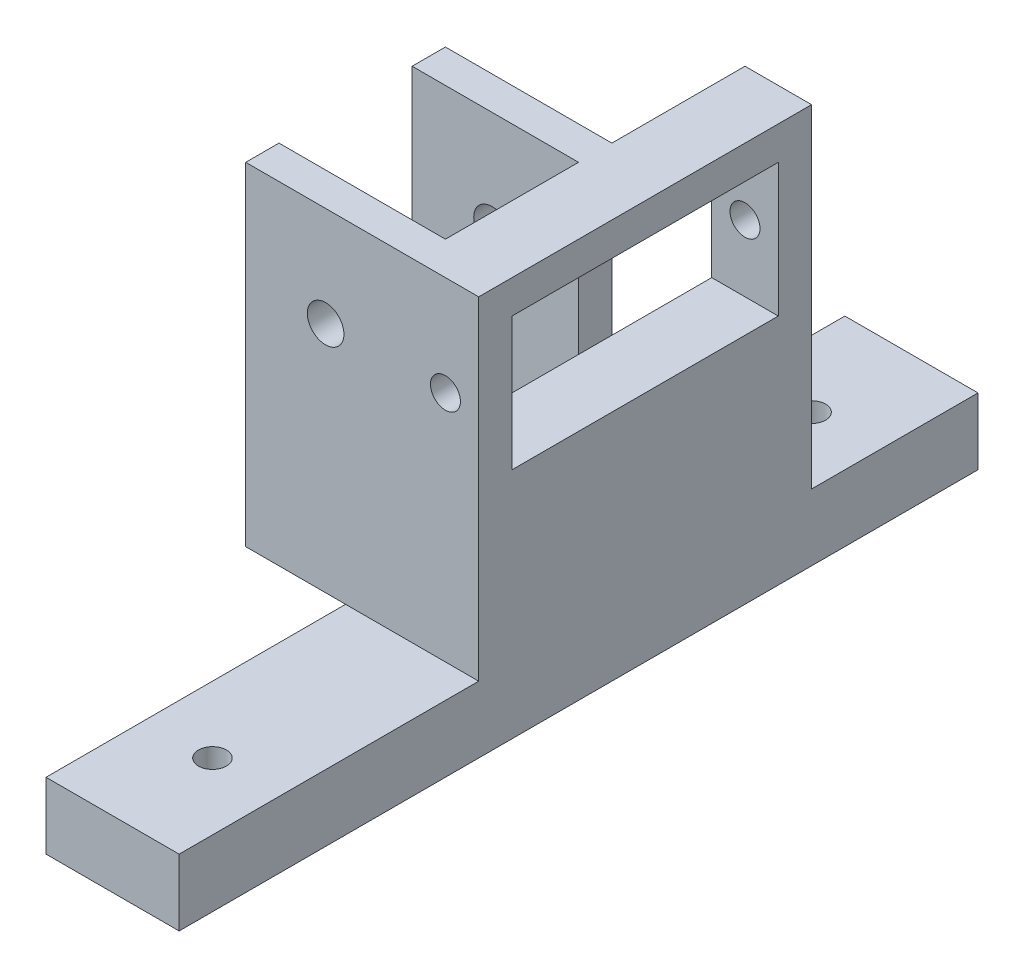
ISO-10303-21;
HEADER;
FILE_DESCRIPTION(('STEP AP214'),'2;1');
FILE_NAME('part.step','',(''),(''),'','','');
FILE_SCHEMA(('AUTOMOTIVE_DESIGN { 1 0 10303 214 1 1 1 1 }'));
ENDSEC;
DATA;
#1=APPLICATION_CONTEXT('core data for automotive mechanical design processes');
#2=APPLICATION_PROTOCOL_DEFINITION('international standard','automotive_design',2000,#1);
#3=PRODUCT_CONTEXT('',#1,'mechanical');
#4=PRODUCT('Part','Part','',(#3));
#5=PRODUCT_RELATED_PRODUCT_CATEGORY('part','',(#4));
#6=PRODUCT_DEFINITION_FORMATION('','',#4);
#7=PRODUCT_DEFINITION_CONTEXT('part definition',#1,'design');
#8=PRODUCT_DEFINITION('design','',#6,#7);
#9=PRODUCT_DEFINITION_SHAPE('','',#8);
#10=(LENGTH_UNIT() NAMED_UNIT(*) SI_UNIT(.MILLI.,.METRE.));
#11=(NAMED_UNIT(*) PLANE_ANGLE_UNIT() SI_UNIT($,.RADIAN.));
#12=(NAMED_UNIT(*) SI_UNIT($,.STERADIAN.) SOLID_ANGLE_UNIT());
#13=UNCERTAINTY_MEASURE_WITH_UNIT(LENGTH_MEASURE(1.E-05),#10,'distance_accuracy_value','');
#14=(GEOMETRIC_REPRESENTATION_CONTEXT(3) GLOBAL_UNCERTAINTY_ASSIGNED_CONTEXT((#13)) GLOBAL_UNIT_ASSIGNED_CONTEXT((#10,
#11,#12)) REPRESENTATION_CONTEXT('',''));
#15=CARTESIAN_POINT('',(0.,0.,0.));
#16=DIRECTION('',(0.,0.,1.));
#17=DIRECTION('',(1.,0.,0.));
#18=AXIS2_PLACEMENT_3D('',#15,#16,#17);
#19=CARTESIAN_POINT('',(0.,5.,0.));
#20=DIRECTION('',(0.,-1.,0.));
#21=DIRECTION('',(0.,0.,-1.));
#22=AXIS2_PLACEMENT_3D('',#19,#20,#21);
#23=PLANE('',#22);
#24=CARTESIAN_POINT('',(30.,5.,-85.));
#25=DIRECTION('',(0.,1.,0.));
#26=DIRECTION('',(0.,0.,1.));
#27=AXIS2_PLACEMENT_3D('',#24,#25,#26);
#28=CIRCLE('',#27,2.1);
#29=CARTESIAN_POINT('',(30.,5.,-82.9));
#30=VERTEX_POINT('',#29);
#31=EDGE_CURVE('E486',#30,#30,#28,.T.);
#32=ORIENTED_EDGE('',*,*,#31,.F.);
#33=EDGE_LOOP('',(#32));
#34=FACE_BOUND('',#33,.T.);
#35=DIRECTION('',(1.,0.,0.));
#36=VECTOR('',#35,1.);
#37=CARTESIAN_POINT('',(-10.,5.,-100.));
#38=LINE('',#37,#36);
#39=CARTESIAN_POINT('',(20.,5.,-100.));
#40=VERTEX_POINT('',#39);
#41=CARTESIAN_POINT('',(40.,5.,-100.));
#42=VERTEX_POINT('',#41);
#43=EDGE_CURVE('E297',#40,#42,#38,.T.);
#44=ORIENTED_EDGE('',*,*,#43,.F.);
#45=DIRECTION('',(0.,0.,-1.));
#46=VECTOR('',#45,1.);
#47=CARTESIAN_POINT('',(20.,5.,-100.));
#48=LINE('',#47,#46);
#49=CARTESIAN_POINT('',(20.,5.,-55.));
#50=VERTEX_POINT('',#49);
#51=EDGE_CURVE('E229',#50,#40,#48,.T.);
#52=ORIENTED_EDGE('',*,*,#51,.F.);
#53=DIRECTION('',(1.,0.,0.));
#54=VECTOR('',#53,1.);
#55=CARTESIAN_POINT('',(5.,5.,-55.));
#56=LINE('',#55,#54);
#57=CARTESIAN_POINT('',(30.,5.,-55.));
#58=VERTEX_POINT('',#57);
#59=EDGE_CURVE('E385',#50,#58,#56,.T.);
#60=ORIENTED_EDGE('',*,*,#59,.T.);
#61=DIRECTION('',(0.,0.,-1.));
#62=VECTOR('',#61,1.);
#63=CARTESIAN_POINT('',(30.,5.,0.));
#64=LINE('',#63,#62);
#65=CARTESIAN_POINT('',(30.,5.,-75.));
#66=VERTEX_POINT('',#65);
#67=EDGE_CURVE('E248',#58,#66,#64,.T.);
#68=ORIENTED_EDGE('',*,*,#67,.T.);
#69=DIRECTION('',(-1.,0.,0.));
#70=VECTOR('',#69,1.);
#71=CARTESIAN_POINT('',(40.,5.,-75.));
#72=LINE('',#71,#70);
#73=CARTESIAN_POINT('',(40.,5.,-75.));
#74=VERTEX_POINT('',#73);
#75=EDGE_CURVE('E289',#74,#66,#72,.T.);
#76=ORIENTED_EDGE('',*,*,#75,.F.);
#77=DIRECTION('',(0.,0.,-1.));
#78=VECTOR('',#77,1.);
#79=CARTESIAN_POINT('',(40.,5.,0.));
#80=LINE('',#79,#78);
#81=EDGE_CURVE('E52',#74,#42,#80,.T.);
#82=ORIENTED_EDGE('',*,*,#81,.T.);
#83=EDGE_LOOP('',(#44,#52,#60,#68,#76,#82));
#84=FACE_BOUND('',#83,.T.);
#85=ADVANCED_FACE('F43',(#34,#84),#23,.F.);
#86=DIRECTION('',(1.,0.,0.));
#87=VECTOR('',#86,1.);
#88=CARTESIAN_POINT('',(5.,5.,-50.));
#89=LINE('',#88,#87);
#90=CARTESIAN_POINT('',(20.,5.,-50.));
#91=VERTEX_POINT('',#90);
#92=CARTESIAN_POINT('',(30.,5.,-50.));
#93=VERTEX_POINT('',#92);
#94=EDGE_CURVE('E60',#91,#93,#89,.T.);
#95=ORIENTED_EDGE('',*,*,#94,.F.);
#96=DIRECTION('',(0.,0.,-1.));
#97=VECTOR('',#96,1.);
#98=CARTESIAN_POINT('',(20.,5.,-25.));
#99=LINE('',#98,#97);
#100=CARTESIAN_POINT('',(20.,5.,-30.));
#101=VERTEX_POINT('',#100);
#102=EDGE_CURVE('E207',#101,#91,#99,.T.);
#103=ORIENTED_EDGE('',*,*,#102,.F.);
#104=DIRECTION('',(1.,0.,0.));
#105=VECTOR('',#104,1.);
#106=CARTESIAN_POINT('',(10.,5.,-30.));
#107=LINE('',#106,#105);
#108=CARTESIAN_POINT('',(30.,5.,-30.));
#109=VERTEX_POINT('',#108);
#110=EDGE_CURVE('E328',#101,#109,#107,.T.);
#111=ORIENTED_EDGE('',*,*,#110,.T.);
#112=EDGE_CURVE('E255',#109,#93,#64,.T.);
#113=ORIENTED_EDGE('',*,*,#112,.T.);
#114=EDGE_LOOP('',(#95,#103,#111,#113));
#115=FACE_BOUND('',#114,.T.);
#116=ADVANCED_FACE('F462',(#115),#23,.F.);
#117=CARTESIAN_POINT('',(30.,55.,0.));
#118=DIRECTION('',(-1.,0.,0.));
#119=DIRECTION('',(0.,0.,1.));
#120=AXIS2_PLACEMENT_3D('',#117,#118,#119);
#121=PLANE('',#120);
#122=DIRECTION('',(0.,0.,-1.));
#123=VECTOR('',#122,1.);
#124=CARTESIAN_POINT('',(30.,55.,0.));
#125=LINE('',#124,#123);
#126=CARTESIAN_POINT('',(30.,55.,-30.));
#127=VERTEX_POINT('',#126);
#128=CARTESIAN_POINT('',(30.,55.,-50.));
#129=VERTEX_POINT('',#128);
#130=EDGE_CURVE('E249',#127,#129,#125,.T.);
#131=ORIENTED_EDGE('',*,*,#130,.T.);
#132=DIRECTION('',(0.,-1.,0.));
#133=VECTOR('',#132,1.);
#134=CARTESIAN_POINT('',(30.,80.4950975679639,-50.));
#135=LINE('',#134,#133);
#136=CARTESIAN_POINT('',(30.,50.,-50.));
#137=VERTEX_POINT('',#136);
#138=EDGE_CURVE('E382',#129,#137,#135,.T.);
#139=ORIENTED_EDGE('',*,*,#138,.T.);
#140=DIRECTION('',(0.,0.,-1.));
#141=VECTOR('',#140,1.);
#142=CARTESIAN_POINT('',(30.,50.,-3.07417596432748));
#143=LINE('',#142,#141);
#144=CARTESIAN_POINT('',(30.,50.,-30.));
#145=VERTEX_POINT('',#144);
#146=EDGE_CURVE('E352',#145,#137,#143,.T.);
#147=ORIENTED_EDGE('',*,*,#146,.F.);
#148=DIRECTION('',(0.,-1.,0.));
#149=VECTOR('',#148,1.);
#150=CARTESIAN_POINT('',(30.,55.,-30.));
#151=LINE('',#150,#149);
#152=EDGE_CURVE('E331',#127,#145,#151,.T.);
#153=ORIENTED_EDGE('',*,*,#152,.F.);
#154=EDGE_LOOP('',(#131,#139,#147,#153));
#155=FACE_BOUND('',#154,.T.);
#156=ADVANCED_FACE('F380',(#155),#121,.T.);
#157=DIRECTION('',(0.,0.,-1.));
#158=VECTOR('',#157,1.);
#159=CARTESIAN_POINT('',(30.,30.,-3.07417596432748));
#160=LINE('',#159,#158);
#161=CARTESIAN_POINT('',(30.,30.,-30.));
#162=VERTEX_POINT('',#161);
#163=CARTESIAN_POINT('',(30.,30.,-50.));
#164=VERTEX_POINT('',#163);
#165=EDGE_CURVE('E346',#162,#164,#160,.T.);
#166=ORIENTED_EDGE('',*,*,#165,.T.);
#167=EDGE_CURVE('E388',#164,#93,#135,.T.);
#168=ORIENTED_EDGE('',*,*,#167,.T.);
#169=ORIENTED_EDGE('',*,*,#112,.F.);
#170=EDGE_CURVE('E330',#162,#109,#151,.T.);
#171=ORIENTED_EDGE('',*,*,#170,.F.);
#172=EDGE_LOOP('',(#166,#168,#169,#171));
#173=FACE_BOUND('',#172,.T.);
#174=ADVANCED_FACE('F479',(#173),#121,.T.);
#175=CARTESIAN_POINT('',(30.,50.,-3.07417596432748));
#176=DIRECTION('',(0.,1.,0.));
#177=DIRECTION('',(0.,0.,1.));
#178=AXIS2_PLACEMENT_3D('',#175,#176,#177);
#179=PLANE('',#178);
#180=DIRECTION('',(1.,0.,0.));
#181=VECTOR('',#180,1.);
#182=CARTESIAN_POINT('',(40.,50.,-70.));
#183=LINE('',#182,#181);
#184=CARTESIAN_POINT('',(30.,50.,-70.));
#185=VERTEX_POINT('',#184);
#186=CARTESIAN_POINT('',(40.,50.,-70.));
#187=VERTEX_POINT('',#186);
#188=EDGE_CURVE('E276',#185,#187,#183,.T.);
#189=ORIENTED_EDGE('',*,*,#188,.T.);
#190=DIRECTION('',(0.,0.,-1.));
#191=VECTOR('',#190,1.);
#192=CARTESIAN_POINT('',(40.,50.,-3.07417596432748));
#193=LINE('',#192,#191);
#194=CARTESIAN_POINT('',(40.,50.,-30.));
#195=VERTEX_POINT('',#194);
#196=EDGE_CURVE('E240',#195,#187,#193,.T.);
#197=ORIENTED_EDGE('',*,*,#196,.F.);
#198=DIRECTION('',(1.,0.,0.));
#199=VECTOR('',#198,1.);
#200=CARTESIAN_POINT('',(30.,50.,-30.));
#201=LINE('',#200,#199);
#202=EDGE_CURVE('E234',#145,#195,#201,.T.);
#203=ORIENTED_EDGE('',*,*,#202,.F.);
#204=ORIENTED_EDGE('',*,*,#146,.T.);
#205=DIRECTION('',(0.,0.,1.));
#206=VECTOR('',#205,1.);
#207=CARTESIAN_POINT('',(30.,50.,-3.07417596432748));
#208=LINE('',#207,#206);
#209=CARTESIAN_POINT('',(30.,50.,-55.));
#210=VERTEX_POINT('',#209);
#211=EDGE_CURVE('E267',#210,#137,#208,.T.);
#212=ORIENTED_EDGE('',*,*,#211,.F.);
#213=EDGE_CURVE('E68',#210,#185,#143,.T.);
#214=ORIENTED_EDGE('',*,*,#213,.T.);
#215=EDGE_LOOP('',(#189,#197,#203,#204,#212,#214));
#216=FACE_BOUND('',#215,.T.);
#217=ADVANCED_FACE('F357',(#216),#179,.F.);
#218=CARTESIAN_POINT('',(30.,30.,-3.07417596432748));
#219=DIRECTION('',(0.,1.,0.));
#220=DIRECTION('',(0.,0.,1.));
#221=AXIS2_PLACEMENT_3D('',#218,#219,#220);
#222=PLANE('',#221);
#223=DIRECTION('',(0.,0.,-1.));
#224=VECTOR('',#223,1.);
#225=CARTESIAN_POINT('',(40.,30.,-3.07417596432748));
#226=LINE('',#225,#224);
#227=CARTESIAN_POINT('',(40.,30.,-30.));
#228=VERTEX_POINT('',#227);
#229=CARTESIAN_POINT('',(40.,30.,-70.));
#230=VERTEX_POINT('',#229);
#231=EDGE_CURVE('E342',#228,#230,#226,.T.);
#232=ORIENTED_EDGE('',*,*,#231,.T.);
#233=DIRECTION('',(1.,0.,0.));
#234=VECTOR('',#233,1.);
#235=CARTESIAN_POINT('',(40.,30.,-70.));
#236=LINE('',#235,#234);
#237=CARTESIAN_POINT('',(30.,30.,-70.));
#238=VERTEX_POINT('',#237);
#239=EDGE_CURVE('E264',#238,#230,#236,.T.);
#240=ORIENTED_EDGE('',*,*,#239,.F.);
#241=CARTESIAN_POINT('',(30.,30.,-55.));
#242=VERTEX_POINT('',#241);
#243=EDGE_CURVE('E341',#242,#238,#160,.T.);
#244=ORIENTED_EDGE('',*,*,#243,.F.);
#245=DIRECTION('',(0.,0.,1.));
#246=VECTOR('',#245,1.);
#247=CARTESIAN_POINT('',(30.,30.,-3.07417596432748));
#248=LINE('',#247,#246);
#249=EDGE_CURVE('E272',#242,#164,#248,.T.);
#250=ORIENTED_EDGE('',*,*,#249,.T.);
#251=ORIENTED_EDGE('',*,*,#165,.F.);
#252=DIRECTION('',(1.,0.,0.));
#253=VECTOR('',#252,1.);
#254=CARTESIAN_POINT('',(30.,30.,-30.));
#255=LINE('',#254,#253);
#256=EDGE_CURVE('E345',#162,#228,#255,.T.);
#257=ORIENTED_EDGE('',*,*,#256,.T.);
#258=EDGE_LOOP('',(#232,#240,#244,#250,#251,#257));
#259=FACE_BOUND('',#258,.T.);
#260=ADVANCED_FACE('F369',(#259),#222,.T.);
#261=CARTESIAN_POINT('',(30.,5.,5.));
#262=DIRECTION('',(0.,1.,0.));
#263=DIRECTION('',(0.,0.,1.));
#264=AXIS2_PLACEMENT_3D('',#261,#262,#263);
#265=CIRCLE('',#264,2.1);
#266=CARTESIAN_POINT('',(30.,5.,7.1));
#267=VERTEX_POINT('',#266);
#268=EDGE_CURVE('E484',#267,#267,#265,.T.);
#269=ORIENTED_EDGE('',*,*,#268,.F.);
#270=EDGE_LOOP('',(#269));
#271=FACE_BOUND('',#270,.T.);
#272=DIRECTION('',(1.,0.,0.));
#273=VECTOR('',#272,1.);
#274=CARTESIAN_POINT('',(0.,5.,-25.));
#275=LINE('',#274,#273);
#276=CARTESIAN_POINT('',(20.,5.,-25.));
#277=VERTEX_POINT('',#276);
#278=CARTESIAN_POINT('',(40.,5.,-25.));
#279=VERTEX_POINT('',#278);
#280=EDGE_CURVE('E215',#277,#279,#275,.T.);
#281=ORIENTED_EDGE('',*,*,#280,.F.);
#282=DIRECTION('',(0.,0.,-1.));
#283=VECTOR('',#282,1.);
#284=CARTESIAN_POINT('',(20.,5.,20.));
#285=LINE('',#284,#283);
#286=CARTESIAN_POINT('',(20.,5.,20.));
#287=VERTEX_POINT('',#286);
#288=EDGE_CURVE('E222',#287,#277,#285,.T.);
#289=ORIENTED_EDGE('',*,*,#288,.F.);
#290=DIRECTION('',(-1.,0.,0.));
#291=VECTOR('',#290,1.);
#292=CARTESIAN_POINT('',(40.,5.,20.));
#293=LINE('',#292,#291);
#294=CARTESIAN_POINT('',(40.,5.,20.));
#295=VERTEX_POINT('',#294);
#296=EDGE_CURVE('E339',#295,#287,#293,.T.);
#297=ORIENTED_EDGE('',*,*,#296,.F.);
#298=EDGE_CURVE('E11',#295,#279,#80,.T.);
#299=ORIENTED_EDGE('',*,*,#298,.T.);
#300=EDGE_LOOP('',(#281,#289,#297,#299));
#301=FACE_BOUND('',#300,.T.);
#302=ADVANCED_FACE('F231',(#271,#301),#23,.F.);
#303=DIRECTION('',(0.,-1.,0.));
#304=VECTOR('',#303,1.);
#305=CARTESIAN_POINT('',(30.,80.4950975679639,-55.));
#306=LINE('',#305,#304);
#307=CARTESIAN_POINT('',(30.,55.,-55.));
#308=VERTEX_POINT('',#307);
#309=EDGE_CURVE('E408',#308,#210,#306,.T.);
#310=ORIENTED_EDGE('',*,*,#309,.F.);
#311=CARTESIAN_POINT('',(30.,55.,-75.));
#312=VERTEX_POINT('',#311);
#313=EDGE_CURVE('E252',#308,#312,#125,.T.);
#314=ORIENTED_EDGE('',*,*,#313,.T.);
#315=DIRECTION('',(0.,1.,0.));
#316=VECTOR('',#315,1.);
#317=CARTESIAN_POINT('',(30.,5.,-75.));
#318=LINE('',#317,#316);
#319=EDGE_CURVE('E292',#66,#312,#318,.T.);
#320=ORIENTED_EDGE('',*,*,#319,.F.);
#321=ORIENTED_EDGE('',*,*,#67,.F.);
#322=EDGE_CURVE('E412',#242,#58,#306,.T.);
#323=ORIENTED_EDGE('',*,*,#322,.F.);
#324=ORIENTED_EDGE('',*,*,#243,.T.);
#325=DIRECTION('',(0.,-1.,0.));
#326=VECTOR('',#325,1.);
#327=CARTESIAN_POINT('',(30.,50.,-70.));
#328=LINE('',#327,#326);
#329=EDGE_CURVE('E283',#185,#238,#328,.T.);
#330=ORIENTED_EDGE('',*,*,#329,.F.);
#331=ORIENTED_EDGE('',*,*,#213,.F.);
#332=EDGE_LOOP('',(#310,#314,#320,#321,#323,#324,#330,#331));
#333=FACE_BOUND('',#332,.T.);
#334=ADVANCED_FACE('F360',(#333),#121,.T.);
#335=CARTESIAN_POINT('',(35.,40.,-75.));
#336=DIRECTION('',(0.,0.,1.));
#337=DIRECTION('',(1.,0.,0.));
#338=AXIS2_PLACEMENT_3D('',#335,#336,#337);
#339=CYLINDRICAL_SURFACE('',#338,2.25);
#340=CARTESIAN_POINT('',(35.,40.,-30.));
#341=DIRECTION('',(0.,0.,1.));
#342=DIRECTION('',(1.,0.,0.));
#343=AXIS2_PLACEMENT_3D('',#340,#341,#342);
#344=CIRCLE('',#343,2.25);
#345=CARTESIAN_POINT('',(37.25,40.,-30.));
#346=VERTEX_POINT('',#345);
#347=EDGE_CURVE('E333',#346,#346,#344,.T.);
#348=ORIENTED_EDGE('',*,*,#347,.F.);
#349=EDGE_LOOP('',(#348));
#350=FACE_BOUND('',#349,.T.);
#351=CARTESIAN_POINT('',(35.,40.,-25.));
#352=DIRECTION('',(0.,0.,-1.));
#353=DIRECTION('',(-1.,0.,0.));
#354=AXIS2_PLACEMENT_3D('',#351,#352,#353);
#355=CIRCLE('',#354,2.25);
#356=CARTESIAN_POINT('',(32.75,40.,-25.));
#357=VERTEX_POINT('',#356);
#358=EDGE_CURVE('E259',#357,#357,#355,.T.);
#359=ORIENTED_EDGE('',*,*,#358,.F.);
#360=EDGE_LOOP('',(#359));
#361=FACE_BOUND('',#360,.T.);
#362=ADVANCED_FACE('F478',(#350,#361),#339,.F.);
#363=CARTESIAN_POINT('',(0.,55.,-30.));
#364=DIRECTION('',(0.,0.,1.));
#365=DIRECTION('',(1.,0.,0.));
#366=AXIS2_PLACEMENT_3D('',#363,#364,#365);
#367=PLANE('',#366);
#368=CARTESIAN_POINT('',(17.,40.,-30.));
#369=DIRECTION('',(0.,0.,1.));
#370=DIRECTION('',(1.,0.,0.));
#371=AXIS2_PLACEMENT_3D('',#368,#369,#370);
#372=CIRCLE('',#371,2.75);
#373=CARTESIAN_POINT('',(19.75,40.,-30.));
#374=VERTEX_POINT('',#373);
#375=EDGE_CURVE('E323',#374,#374,#372,.T.);
#376=ORIENTED_EDGE('',*,*,#375,.T.);
#377=EDGE_LOOP('',(#376));
#378=FACE_BOUND('',#377,.T.);
#379=ORIENTED_EDGE('',*,*,#347,.T.);
#380=EDGE_LOOP('',(#379));
#381=FACE_BOUND('',#380,.T.);
#382=DIRECTION('',(0.,-1.,0.));
#383=VECTOR('',#382,1.);
#384=CARTESIAN_POINT('',(40.,55.,-30.));
#385=LINE('',#384,#383);
#386=EDGE_CURVE('E237',#195,#228,#385,.T.);
#387=ORIENTED_EDGE('',*,*,#386,.T.);
#388=ORIENTED_EDGE('',*,*,#256,.F.);
#389=ORIENTED_EDGE('',*,*,#170,.T.);
#390=ORIENTED_EDGE('',*,*,#110,.F.);
#391=CARTESIAN_POINT('',(5.,5.,-30.));
#392=VERTEX_POINT('',#391);
#393=EDGE_CURVE('E201',#392,#101,#107,.T.);
#394=ORIENTED_EDGE('',*,*,#393,.F.);
#395=DIRECTION('',(0.,-1.,0.));
#396=VECTOR('',#395,1.);
#397=CARTESIAN_POINT('',(5.,55.,-30.));
#398=LINE('',#397,#396);
#399=CARTESIAN_POINT('',(5.,55.,-30.));
#400=VERTEX_POINT('',#399);
#401=EDGE_CURVE('E311',#400,#392,#398,.T.);
#402=ORIENTED_EDGE('',*,*,#401,.F.);
#403=DIRECTION('',(1.,0.,0.));
#404=VECTOR('',#403,1.);
#405=CARTESIAN_POINT('',(10.,55.,-30.));
#406=LINE('',#405,#404);
#407=EDGE_CURVE('E326',#400,#127,#406,.T.);
#408=ORIENTED_EDGE('',*,*,#407,.T.);
#409=ORIENTED_EDGE('',*,*,#152,.T.);
#410=ORIENTED_EDGE('',*,*,#202,.T.);
#411=EDGE_LOOP('',(#387,#388,#389,#390,#394,#402,#408,#409,#410));
#412=FACE_BOUND('',#411,.T.);
#413=ADVANCED_FACE('F375',(#378,#381,#412),#367,.F.);
#414=CARTESIAN_POINT('',(40.,5.,0.));
#415=DIRECTION('',(-1.,0.,0.));
#416=DIRECTION('',(0.,0.,1.));
#417=AXIS2_PLACEMENT_3D('',#414,#415,#416);
#418=PLANE('',#417);
#419=DIRECTION('',(0.,-1.,0.));
#420=VECTOR('',#419,1.);
#421=CARTESIAN_POINT('',(40.,30.,-75.));
#422=LINE('',#421,#420);
#423=CARTESIAN_POINT('',(40.,55.,-75.));
#424=VERTEX_POINT('',#423);
#425=EDGE_CURVE('E295',#424,#74,#422,.T.);
#426=ORIENTED_EDGE('',*,*,#425,.F.);
#427=DIRECTION('',(0.,0.,-1.));
#428=VECTOR('',#427,1.);
#429=CARTESIAN_POINT('',(40.,55.,0.));
#430=LINE('',#429,#428);
#431=CARTESIAN_POINT('',(40.,55.,-25.));
#432=VERTEX_POINT('',#431);
#433=EDGE_CURVE('E251',#432,#424,#430,.T.);
#434=ORIENTED_EDGE('',*,*,#433,.F.);
#435=DIRECTION('',(0.,-1.,0.));
#436=VECTOR('',#435,1.);
#437=CARTESIAN_POINT('',(40.,55.,-25.));
#438=LINE('',#437,#436);
#439=EDGE_CURVE('E246',#432,#279,#438,.T.);
#440=ORIENTED_EDGE('',*,*,#439,.T.);
#441=ORIENTED_EDGE('',*,*,#298,.F.);
#442=DIRECTION('',(0.,1.,0.));
#443=VECTOR('',#442,1.);
#444=CARTESIAN_POINT('',(40.,0.,20.));
#445=LINE('',#444,#443);
#446=CARTESIAN_POINT('',(40.,-5.,20.));
#447=VERTEX_POINT('',#446);
#448=EDGE_CURVE('E336',#447,#295,#445,.T.);
#449=ORIENTED_EDGE('',*,*,#448,.F.);
#450=DIRECTION('',(0.,0.,1.));
#451=VECTOR('',#450,1.);
#452=CARTESIAN_POINT('',(40.,-5.,-80.));
#453=LINE('',#452,#451);
#454=CARTESIAN_POINT('',(40.,-5.,-100.));
#455=VERTEX_POINT('',#454);
#456=EDGE_CURVE('E305',#455,#447,#453,.T.);
#457=ORIENTED_EDGE('',*,*,#456,.F.);
#458=DIRECTION('',(0.,-1.,0.));
#459=VECTOR('',#458,1.);
#460=CARTESIAN_POINT('',(40.,5.,-100.));
#461=LINE('',#460,#459);
#462=EDGE_CURVE('E299',#42,#455,#461,.T.);
#463=ORIENTED_EDGE('',*,*,#462,.F.);
#464=ORIENTED_EDGE('',*,*,#81,.F.);
#465=EDGE_LOOP('',(#426,#434,#440,#441,#449,#457,#463,#464));
#466=FACE_BOUND('',#465,.T.);
#467=ORIENTED_EDGE('',*,*,#196,.T.);
#468=DIRECTION('',(0.,-1.,0.));
#469=VECTOR('',#468,1.);
#470=CARTESIAN_POINT('',(40.,50.,-70.));
#471=LINE('',#470,#469);
#472=EDGE_CURVE('E279',#187,#230,#471,.T.);
#473=ORIENTED_EDGE('',*,*,#472,.T.);
#474=ORIENTED_EDGE('',*,*,#231,.F.);
#475=ORIENTED_EDGE('',*,*,#386,.F.);
#476=EDGE_LOOP('',(#467,#473,#474,#475));
#477=FACE_BOUND('',#476,.T.);
#478=ADVANCED_FACE('F45',(#466,#477),#418,.F.);
#479=CARTESIAN_POINT('',(0.,55.,0.));
#480=DIRECTION('',(0.,1.,0.));
#481=DIRECTION('',(0.,0.,1.));
#482=AXIS2_PLACEMENT_3D('',#479,#480,#481);
#483=PLANE('',#482);
#484=ORIENTED_EDGE('',*,*,#433,.T.);
#485=DIRECTION('',(1.,0.,0.));
#486=VECTOR('',#485,1.);
#487=CARTESIAN_POINT('',(30.,55.,-75.));
#488=LINE('',#487,#486);
#489=EDGE_CURVE('E286',#312,#424,#488,.T.);
#490=ORIENTED_EDGE('',*,*,#489,.F.);
#491=ORIENTED_EDGE('',*,*,#313,.F.);
#492=DIRECTION('',(1.,0.,0.));
#493=VECTOR('',#492,1.);
#494=CARTESIAN_POINT('',(5.,55.,-55.));
#495=LINE('',#494,#493);
#496=CARTESIAN_POINT('',(5.,55.,-55.));
#497=VERTEX_POINT('',#496);
#498=EDGE_CURVE('E409',#497,#308,#495,.T.);
#499=ORIENTED_EDGE('',*,*,#498,.F.);
#500=DIRECTION('',(0.,0.,-1.));
#501=VECTOR('',#500,1.);
#502=CARTESIAN_POINT('',(5.,55.,-50.));
#503=LINE('',#502,#501);
#504=CARTESIAN_POINT('',(5.,55.,-50.));
#505=VERTEX_POINT('',#504);
#506=EDGE_CURVE('E405',#505,#497,#503,.T.);
#507=ORIENTED_EDGE('',*,*,#506,.F.);
#508=DIRECTION('',(1.,0.,0.));
#509=VECTOR('',#508,1.);
#510=CARTESIAN_POINT('',(5.,55.,-50.));
#511=LINE('',#510,#509);
#512=EDGE_CURVE('E403',#505,#129,#511,.T.);
#513=ORIENTED_EDGE('',*,*,#512,.T.);
#514=ORIENTED_EDGE('',*,*,#130,.F.);
#515=ORIENTED_EDGE('',*,*,#407,.F.);
#516=DIRECTION('',(0.,0.,-1.));
#517=VECTOR('',#516,1.);
#518=CARTESIAN_POINT('',(5.,55.,-25.));
#519=LINE('',#518,#517);
#520=CARTESIAN_POINT('',(5.,55.,-25.));
#521=VERTEX_POINT('',#520);
#522=EDGE_CURVE('E314',#521,#400,#519,.T.);
#523=ORIENTED_EDGE('',*,*,#522,.F.);
#524=DIRECTION('',(1.,0.,0.));
#525=VECTOR('',#524,1.);
#526=CARTESIAN_POINT('',(0.,55.,-25.));
#527=LINE('',#526,#525);
#528=EDGE_CURVE('E233',#521,#432,#527,.T.);
#529=ORIENTED_EDGE('',*,*,#528,.T.);
#530=EDGE_LOOP('',(#484,#490,#491,#499,#507,#513,#514,#515,#523,#529));
#531=FACE_BOUND('',#530,.T.);
#532=ADVANCED_FACE('F535',(#531),#483,.T.);
#533=CARTESIAN_POINT('',(0.,55.,-25.));
#534=DIRECTION('',(0.,0.,-1.));
#535=DIRECTION('',(-1.,0.,0.));
#536=AXIS2_PLACEMENT_3D('',#533,#534,#535);
#537=PLANE('',#536);
#538=CARTESIAN_POINT('',(17.,40.,-25.));
#539=DIRECTION('',(0.,0.,1.));
#540=DIRECTION('',(1.,0.,0.));
#541=AXIS2_PLACEMENT_3D('',#538,#539,#540);
#542=CIRCLE('',#541,2.75);
#543=CARTESIAN_POINT('',(19.75,40.,-25.));
#544=VERTEX_POINT('',#543);
#545=EDGE_CURVE('E320',#544,#544,#542,.T.);
#546=ORIENTED_EDGE('',*,*,#545,.F.);
#547=EDGE_LOOP('',(#546));
#548=FACE_BOUND('',#547,.T.);
#549=DIRECTION('',(0.,1.,0.));
#550=VECTOR('',#549,1.);
#551=CARTESIAN_POINT('',(5.,5.,-25.));
#552=LINE('',#551,#550);
#553=CARTESIAN_POINT('',(5.00000000000001,5.,-25.));
#554=VERTEX_POINT('',#553);
#555=EDGE_CURVE('E217',#554,#521,#552,.T.);
#556=ORIENTED_EDGE('',*,*,#555,.F.);
#557=DIRECTION('',(-1.,0.,0.));
#558=VECTOR('',#557,1.);
#559=CARTESIAN_POINT('',(51.6227766016838,5.,-25.));
#560=LINE('',#559,#558);
#561=EDGE_CURVE('E198',#277,#554,#560,.T.);
#562=ORIENTED_EDGE('',*,*,#561,.F.);
#563=ORIENTED_EDGE('',*,*,#280,.T.);
#564=ORIENTED_EDGE('',*,*,#439,.F.);
#565=ORIENTED_EDGE('',*,*,#528,.F.);
#566=EDGE_LOOP('',(#556,#562,#563,#564,#565));
#567=FACE_BOUND('',#566,.T.);
#568=ORIENTED_EDGE('',*,*,#358,.T.);
#569=EDGE_LOOP('',(#568));
#570=FACE_BOUND('',#569,.T.);
#571=ADVANCED_FACE('F211',(#548,#567,#570),#537,.F.);
#572=CARTESIAN_POINT('',(0.,0.,20.));
#573=DIRECTION('',(0.,0.,1.));
#574=DIRECTION('',(1.,0.,0.));
#575=AXIS2_PLACEMENT_3D('',#572,#573,#574);
#576=PLANE('',#575);
#577=DIRECTION('',(0.,1.,0.));
#578=VECTOR('',#577,1.);
#579=CARTESIAN_POINT('',(20.,-5.,20.));
#580=LINE('',#579,#578);
#581=CARTESIAN_POINT('',(20.,-5.,20.));
#582=VERTEX_POINT('',#581);
#583=EDGE_CURVE('E225',#582,#287,#580,.T.);
#584=ORIENTED_EDGE('',*,*,#583,.F.);
#585=DIRECTION('',(-1.,0.,0.));
#586=VECTOR('',#585,1.);
#587=CARTESIAN_POINT('',(40.,-5.,20.));
#588=LINE('',#587,#586);
#589=EDGE_CURVE('E308',#447,#582,#588,.T.);
#590=ORIENTED_EDGE('',*,*,#589,.F.);
#591=ORIENTED_EDGE('',*,*,#448,.T.);
#592=ORIENTED_EDGE('',*,*,#296,.T.);
#593=EDGE_LOOP('',(#584,#590,#591,#592));
#594=FACE_BOUND('',#593,.T.);
#595=ADVANCED_FACE('F534',(#594),#576,.T.);
#596=CARTESIAN_POINT('',(17.,40.,-62.778174593052));
#597=DIRECTION('',(0.,0.,1.));
#598=DIRECTION('',(1.,0.,0.));
#599=AXIS2_PLACEMENT_3D('',#596,#597,#598);
#600=CYLINDRICAL_SURFACE('',#599,2.75);
#601=ORIENTED_EDGE('',*,*,#545,.T.);
#602=EDGE_LOOP('',(#601));
#603=FACE_BOUND('',#602,.T.);
#604=ORIENTED_EDGE('',*,*,#375,.F.);
#605=EDGE_LOOP('',(#604));
#606=FACE_BOUND('',#605,.T.);
#607=ADVANCED_FACE('F687',(#603,#606),#600,.F.);
#608=CARTESIAN_POINT('',(5.,0.,0.));
#609=DIRECTION('',(-1.,0.,0.));
#610=DIRECTION('',(0.,0.,1.));
#611=AXIS2_PLACEMENT_3D('',#608,#609,#610);
#612=PLANE('',#611);
#613=DIRECTION('',(0.,0.,1.));
#614=VECTOR('',#613,1.);
#615=CARTESIAN_POINT('',(5.,5.,-30.));
#616=LINE('',#615,#614);
#617=EDGE_CURVE('E318',#392,#554,#616,.T.);
#618=ORIENTED_EDGE('',*,*,#617,.T.);
#619=ORIENTED_EDGE('',*,*,#555,.T.);
#620=ORIENTED_EDGE('',*,*,#522,.T.);
#621=ORIENTED_EDGE('',*,*,#401,.T.);
#622=EDGE_LOOP('',(#618,#619,#620,#621));
#623=FACE_BOUND('',#622,.T.);
#624=ADVANCED_FACE('F678',(#623),#612,.T.);
#625=CARTESIAN_POINT('',(0.,-5.,0.));
#626=DIRECTION('',(0.,-1.,0.));
#627=DIRECTION('',(0.,0.,-1.));
#628=AXIS2_PLACEMENT_3D('',#625,#626,#627);
#629=PLANE('',#628);
#630=CARTESIAN_POINT('',(30.,-5.,-85.));
#631=DIRECTION('',(0.,1.,0.));
#632=DIRECTION('',(0.,0.,1.));
#633=AXIS2_PLACEMENT_3D('',#630,#631,#632);
#634=CIRCLE('',#633,2.1);
#635=CARTESIAN_POINT('',(30.,-5.,-82.9));
#636=VERTEX_POINT('',#635);
#637=EDGE_CURVE('E219',#636,#636,#634,.T.);
#638=ORIENTED_EDGE('',*,*,#637,.T.);
#639=EDGE_LOOP('',(#638));
#640=FACE_BOUND('',#639,.T.);
#641=CARTESIAN_POINT('',(30.,-5.,5.));
#642=DIRECTION('',(0.,1.,0.));
#643=DIRECTION('',(0.,0.,1.));
#644=AXIS2_PLACEMENT_3D('',#641,#642,#643);
#645=CIRCLE('',#644,2.1);
#646=CARTESIAN_POINT('',(30.,-5.,7.1));
#647=VERTEX_POINT('',#646);
#648=EDGE_CURVE('E487',#647,#647,#645,.T.);
#649=ORIENTED_EDGE('',*,*,#648,.T.);
#650=EDGE_LOOP('',(#649));
#651=FACE_BOUND('',#650,.T.);
#652=ORIENTED_EDGE('',*,*,#589,.T.);
#653=DIRECTION('',(0.,0.,-1.));
#654=VECTOR('',#653,1.);
#655=CARTESIAN_POINT('',(20.,-5.,-100.));
#656=LINE('',#655,#654);
#657=CARTESIAN_POINT('',(20.,-5.,-100.));
#658=VERTEX_POINT('',#657);
#659=EDGE_CURVE('E435',#582,#658,#656,.T.);
#660=ORIENTED_EDGE('',*,*,#659,.T.);
#661=DIRECTION('',(-1.,0.,0.));
#662=VECTOR('',#661,1.);
#663=CARTESIAN_POINT('',(40.,-5.,-100.));
#664=LINE('',#663,#662);
#665=EDGE_CURVE('E302',#455,#658,#664,.T.);
#666=ORIENTED_EDGE('',*,*,#665,.F.);
#667=ORIENTED_EDGE('',*,*,#456,.T.);
#668=EDGE_LOOP('',(#652,#660,#666,#667));
#669=FACE_BOUND('',#668,.T.);
#670=ADVANCED_FACE('F497',(#640,#651,#669),#629,.T.);
#671=CARTESIAN_POINT('',(0.,0.,-100.));
#672=DIRECTION('',(0.,0.,-1.));
#673=DIRECTION('',(-1.,0.,0.));
#674=AXIS2_PLACEMENT_3D('',#671,#672,#673);
#675=PLANE('',#674);
#676=DIRECTION('',(0.,1.,0.));
#677=VECTOR('',#676,1.);
#678=CARTESIAN_POINT('',(20.,-5.,-100.));
#679=LINE('',#678,#677);
#680=EDGE_CURVE('E438',#658,#40,#679,.T.);
#681=ORIENTED_EDGE('',*,*,#680,.T.);
#682=ORIENTED_EDGE('',*,*,#43,.T.);
#683=ORIENTED_EDGE('',*,*,#462,.T.);
#684=ORIENTED_EDGE('',*,*,#665,.T.);
#685=EDGE_LOOP('',(#681,#682,#683,#684));
#686=FACE_BOUND('',#685,.T.);
#687=ADVANCED_FACE('F651',(#686),#675,.T.);
#688=CARTESIAN_POINT('',(0.,0.,-75.));
#689=DIRECTION('',(0.,0.,-1.));
#690=DIRECTION('',(-1.,0.,0.));
#691=AXIS2_PLACEMENT_3D('',#688,#689,#690);
#692=PLANE('',#691);
#693=CARTESIAN_POINT('',(35.,40.,-75.));
#694=DIRECTION('',(0.,0.,1.));
#695=DIRECTION('',(1.,0.,0.));
#696=AXIS2_PLACEMENT_3D('',#693,#694,#695);
#697=CIRCLE('',#696,2.25);
#698=CARTESIAN_POINT('',(37.25,40.,-75.));
#699=VERTEX_POINT('',#698);
#700=EDGE_CURVE('E260',#699,#699,#697,.T.);
#701=ORIENTED_EDGE('',*,*,#700,.T.);
#702=EDGE_LOOP('',(#701));
#703=FACE_BOUND('',#702,.T.);
#704=ORIENTED_EDGE('',*,*,#75,.T.);
#705=ORIENTED_EDGE('',*,*,#319,.T.);
#706=ORIENTED_EDGE('',*,*,#489,.T.);
#707=ORIENTED_EDGE('',*,*,#425,.T.);
#708=EDGE_LOOP('',(#704,#705,#706,#707));
#709=FACE_BOUND('',#708,.T.);
#710=ADVANCED_FACE('F621',(#703,#709),#692,.T.);
#711=CARTESIAN_POINT('',(40.,50.,-70.));
#712=DIRECTION('',(0.,0.,-1.));
#713=DIRECTION('',(-1.,0.,0.));
#714=AXIS2_PLACEMENT_3D('',#711,#712,#713);
#715=PLANE('',#714);
#716=CARTESIAN_POINT('',(35.,40.,-70.));
#717=DIRECTION('',(0.,0.,-1.));
#718=DIRECTION('',(-1.,0.,0.));
#719=AXIS2_PLACEMENT_3D('',#716,#717,#718);
#720=CIRCLE('',#719,2.25);
#721=CARTESIAN_POINT('',(32.75,40.,-70.));
#722=VERTEX_POINT('',#721);
#723=EDGE_CURVE('E257',#722,#722,#720,.T.);
#724=ORIENTED_EDGE('',*,*,#723,.T.);
#725=EDGE_LOOP('',(#724));
#726=FACE_BOUND('',#725,.T.);
#727=ORIENTED_EDGE('',*,*,#239,.T.);
#728=ORIENTED_EDGE('',*,*,#472,.F.);
#729=ORIENTED_EDGE('',*,*,#188,.F.);
#730=ORIENTED_EDGE('',*,*,#329,.T.);
#731=EDGE_LOOP('',(#727,#728,#729,#730));
#732=FACE_BOUND('',#731,.T.);
#733=ADVANCED_FACE('F365',(#726,#732),#715,.F.);
#734=CARTESIAN_POINT('',(35.,40.,-75.));
#735=DIRECTION('',(0.,0.,1.));
#736=DIRECTION('',(1.,0.,0.));
#737=AXIS2_PLACEMENT_3D('',#734,#735,#736);
#738=CYLINDRICAL_SURFACE('',#737,2.25);
#739=ORIENTED_EDGE('',*,*,#700,.F.);
#740=EDGE_LOOP('',(#739));
#741=FACE_BOUND('',#740,.T.);
#742=ORIENTED_EDGE('',*,*,#723,.F.);
#743=EDGE_LOOP('',(#742));
#744=FACE_BOUND('',#743,.T.);
#745=ADVANCED_FACE('F580',(#741,#744),#738,.F.);
#746=CARTESIAN_POINT('',(30.,80.4950975679639,-50.));
#747=DIRECTION('',(-1.,0.,0.));
#748=DIRECTION('',(0.,0.,1.));
#749=AXIS2_PLACEMENT_3D('',#746,#747,#748);
#750=PLANE('',#749);
#751=EDGE_CURVE('E967',#210,#242,#306,.T.);
#752=ORIENTED_EDGE('',*,*,#751,.F.);
#753=ORIENTED_EDGE('',*,*,#211,.T.);
#754=EDGE_CURVE('E386',#137,#164,#135,.T.);
#755=ORIENTED_EDGE('',*,*,#754,.T.);
#756=ORIENTED_EDGE('',*,*,#249,.F.);
#757=EDGE_LOOP('',(#752,#753,#755,#756));
#758=FACE_BOUND('',#757,.T.);
#759=ADVANCED_FACE('F526',(#758),#750,.F.);
#760=CARTESIAN_POINT('',(5.,80.4950975679639,-55.));
#761=DIRECTION('',(0.,0.,-1.));
#762=DIRECTION('',(-1.,0.,0.));
#763=AXIS2_PLACEMENT_3D('',#760,#761,#762);
#764=PLANE('',#763);
#765=DIRECTION('',(-1.,0.,0.));
#766=VECTOR('',#765,1.);
#767=CARTESIAN_POINT('',(51.6227766016838,5.,-55.));
#768=LINE('',#767,#766);
#769=CARTESIAN_POINT('',(5.00000000000001,5.,-55.));
#770=VERTEX_POINT('',#769);
#771=EDGE_CURVE('E206',#50,#770,#768,.T.);
#772=ORIENTED_EDGE('',*,*,#771,.T.);
#773=DIRECTION('',(0.,-1.,0.));
#774=VECTOR('',#773,1.);
#775=CARTESIAN_POINT('',(5.,80.4950975679639,-55.));
#776=LINE('',#775,#774);
#777=EDGE_CURVE('E407',#497,#770,#776,.T.);
#778=ORIENTED_EDGE('',*,*,#777,.F.);
#779=ORIENTED_EDGE('',*,*,#498,.T.);
#780=ORIENTED_EDGE('',*,*,#309,.T.);
#781=ORIENTED_EDGE('',*,*,#751,.T.);
#782=ORIENTED_EDGE('',*,*,#322,.T.);
#783=ORIENTED_EDGE('',*,*,#59,.F.);
#784=EDGE_LOOP('',(#772,#778,#779,#780,#781,#782,#783));
#785=FACE_BOUND('',#784,.T.);
#786=CARTESIAN_POINT('',(17.,40.,-55.));
#787=DIRECTION('',(0.,0.,1.));
#788=DIRECTION('',(1.,0.,0.));
#789=AXIS2_PLACEMENT_3D('',#786,#787,#788);
#790=CIRCLE('',#789,2.75);
#791=CARTESIAN_POINT('',(19.75,40.,-55.));
#792=VERTEX_POINT('',#791);
#793=EDGE_CURVE('E441',#792,#792,#790,.T.);
#794=ORIENTED_EDGE('',*,*,#793,.T.);
#795=EDGE_LOOP('',(#794));
#796=FACE_BOUND('',#795,.T.);
#797=ADVANCED_FACE('F428',(#785,#796),#764,.T.);
#798=CARTESIAN_POINT('',(5.,80.4950975679639,-50.));
#799=DIRECTION('',(-1.,0.,0.));
#800=DIRECTION('',(0.,0.,1.));
#801=AXIS2_PLACEMENT_3D('',#798,#799,#800);
#802=PLANE('',#801);
#803=DIRECTION('',(0.,-1.,0.));
#804=VECTOR('',#803,1.);
#805=CARTESIAN_POINT('',(5.,80.4950975679639,-50.));
#806=LINE('',#805,#804);
#807=CARTESIAN_POINT('',(5.,5.,-50.));
#808=VERTEX_POINT('',#807);
#809=EDGE_CURVE('E399',#505,#808,#806,.T.);
#810=ORIENTED_EDGE('',*,*,#809,.F.);
#811=ORIENTED_EDGE('',*,*,#506,.T.);
#812=ORIENTED_EDGE('',*,*,#777,.T.);
#813=DIRECTION('',(0.,0.,-1.));
#814=VECTOR('',#813,1.);
#815=CARTESIAN_POINT('',(5.,5.,-50.));
#816=LINE('',#815,#814);
#817=EDGE_CURVE('E389',#808,#770,#816,.T.);
#818=ORIENTED_EDGE('',*,*,#817,.F.);
#819=EDGE_LOOP('',(#810,#811,#812,#818));
#820=FACE_BOUND('',#819,.T.);
#821=ADVANCED_FACE('F419',(#820),#802,.T.);
#822=CARTESIAN_POINT('',(5.,80.4950975679639,-50.));
#823=DIRECTION('',(0.,0.,-1.));
#824=DIRECTION('',(-1.,0.,0.));
#825=AXIS2_PLACEMENT_3D('',#822,#823,#824);
#826=PLANE('',#825);
#827=CARTESIAN_POINT('',(17.,40.,-50.));
#828=DIRECTION('',(0.,0.,-1.));
#829=DIRECTION('',(-1.,0.,0.));
#830=AXIS2_PLACEMENT_3D('',#827,#828,#829);
#831=CIRCLE('',#830,2.75);
#832=CARTESIAN_POINT('',(14.25,40.,-50.));
#833=VERTEX_POINT('',#832);
#834=EDGE_CURVE('E47',#833,#833,#831,.T.);
#835=ORIENTED_EDGE('',*,*,#834,.T.);
#836=EDGE_LOOP('',(#835));
#837=FACE_BOUND('',#836,.T.);
#838=ORIENTED_EDGE('',*,*,#512,.F.);
#839=ORIENTED_EDGE('',*,*,#809,.T.);
#840=EDGE_CURVE('E394',#808,#91,#89,.T.);
#841=ORIENTED_EDGE('',*,*,#840,.T.);
#842=ORIENTED_EDGE('',*,*,#94,.T.);
#843=ORIENTED_EDGE('',*,*,#167,.F.);
#844=ORIENTED_EDGE('',*,*,#754,.F.);
#845=ORIENTED_EDGE('',*,*,#138,.F.);
#846=EDGE_LOOP('',(#838,#839,#841,#842,#843,#844,#845));
#847=FACE_BOUND('',#846,.T.);
#848=ADVANCED_FACE('F416',(#837,#847),#826,.F.);
#849=CARTESIAN_POINT('',(17.,40.,-55.));
#850=DIRECTION('',(0.,0.,1.));
#851=DIRECTION('',(1.,0.,0.));
#852=AXIS2_PLACEMENT_3D('',#849,#850,#851);
#853=CYLINDRICAL_SURFACE('',#852,2.75);
#854=ORIENTED_EDGE('',*,*,#793,.F.);
#855=EDGE_LOOP('',(#854));
#856=FACE_BOUND('',#855,.T.);
#857=ORIENTED_EDGE('',*,*,#834,.F.);
#858=EDGE_LOOP('',(#857));
#859=FACE_BOUND('',#858,.T.);
#860=ADVANCED_FACE('F448',(#856,#859),#853,.F.);
#861=CARTESIAN_POINT('',(20.,-5.,-100.));
#862=DIRECTION('',(1.,0.,0.));
#863=DIRECTION('',(0.,0.,-1.));
#864=AXIS2_PLACEMENT_3D('',#861,#862,#863);
#865=PLANE('',#864);
#866=ORIENTED_EDGE('',*,*,#51,.T.);
#867=ORIENTED_EDGE('',*,*,#680,.F.);
#868=ORIENTED_EDGE('',*,*,#659,.F.);
#869=ORIENTED_EDGE('',*,*,#583,.T.);
#870=ORIENTED_EDGE('',*,*,#288,.T.);
#871=EDGE_CURVE('E195',#277,#101,#99,.T.);
#872=ORIENTED_EDGE('',*,*,#871,.T.);
#873=ORIENTED_EDGE('',*,*,#102,.T.);
#874=EDGE_CURVE('E209',#91,#50,#99,.T.);
#875=ORIENTED_EDGE('',*,*,#874,.T.);
#876=EDGE_LOOP('',(#866,#867,#868,#869,#870,#872,#873,#875));
#877=FACE_BOUND('',#876,.T.);
#878=ADVANCED_FACE('F223',(#877),#865,.F.);
#879=CARTESIAN_POINT('',(51.6227766016838,5.,-25.));
#880=DIRECTION('',(0.,1.,0.));
#881=DIRECTION('',(0.,0.,1.));
#882=AXIS2_PLACEMENT_3D('',#879,#880,#881);
#883=PLANE('',#882);
#884=ORIENTED_EDGE('',*,*,#871,.F.);
#885=ORIENTED_EDGE('',*,*,#561,.T.);
#886=ORIENTED_EDGE('',*,*,#617,.F.);
#887=ORIENTED_EDGE('',*,*,#393,.T.);
#888=EDGE_LOOP('',(#884,#885,#886,#887));
#889=FACE_BOUND('',#888,.T.);
#890=ADVANCED_FACE('F197',(#889),#883,.F.);
#891=ORIENTED_EDGE('',*,*,#817,.T.);
#892=ORIENTED_EDGE('',*,*,#771,.F.);
#893=ORIENTED_EDGE('',*,*,#874,.F.);
#894=ORIENTED_EDGE('',*,*,#840,.F.);
#895=EDGE_LOOP('',(#891,#892,#893,#894));
#896=FACE_BOUND('',#895,.T.);
#897=ADVANCED_FACE('F424',(#896),#883,.F.);
#898=CARTESIAN_POINT('',(30.,-5.,5.));
#899=DIRECTION('',(0.,1.,0.));
#900=DIRECTION('',(0.,0.,1.));
#901=AXIS2_PLACEMENT_3D('',#898,#899,#900);
#902=CYLINDRICAL_SURFACE('',#901,2.1);
#903=ORIENTED_EDGE('',*,*,#648,.F.);
#904=EDGE_LOOP('',(#903));
#905=FACE_BOUND('',#904,.T.);
#906=ORIENTED_EDGE('',*,*,#268,.T.);
#907=EDGE_LOOP('',(#906));
#908=FACE_BOUND('',#907,.T.);
#909=ADVANCED_FACE('F503',(#905,#908),#902,.F.);
#910=CARTESIAN_POINT('',(30.,-5.,-85.));
#911=DIRECTION('',(0.,1.,0.));
#912=DIRECTION('',(0.,0.,1.));
#913=AXIS2_PLACEMENT_3D('',#910,#911,#912);
#914=CYLINDRICAL_SURFACE('',#913,2.1);
#915=ORIENTED_EDGE('',*,*,#637,.F.);
#916=EDGE_LOOP('',(#915));
#917=FACE_BOUND('',#916,.T.);
#918=ORIENTED_EDGE('',*,*,#31,.T.);
#919=EDGE_LOOP('',(#918));
#920=FACE_BOUND('',#919,.T.);
#921=ADVANCED_FACE('F500',(#917,#920),#914,.F.);
#922=CLOSED_SHELL('',(#85,#116,#156,#174,#217,#260,#302,#334,#362,#413,#478,#532,#571,#595,#607,
#624,#670,#687,#710,#733,#745,#759,#797,#821,#848,#860,#878,#890,#897,#909,#921));
#923=MANIFOLD_SOLID_BREP('B2',#922);
#924=ADVANCED_BREP_SHAPE_REPRESENTATION('',(#18,#923),#14);
#925=SHAPE_DEFINITION_REPRESENTATION(#9,#924);
ENDSEC;
END-ISO-10303-21;
